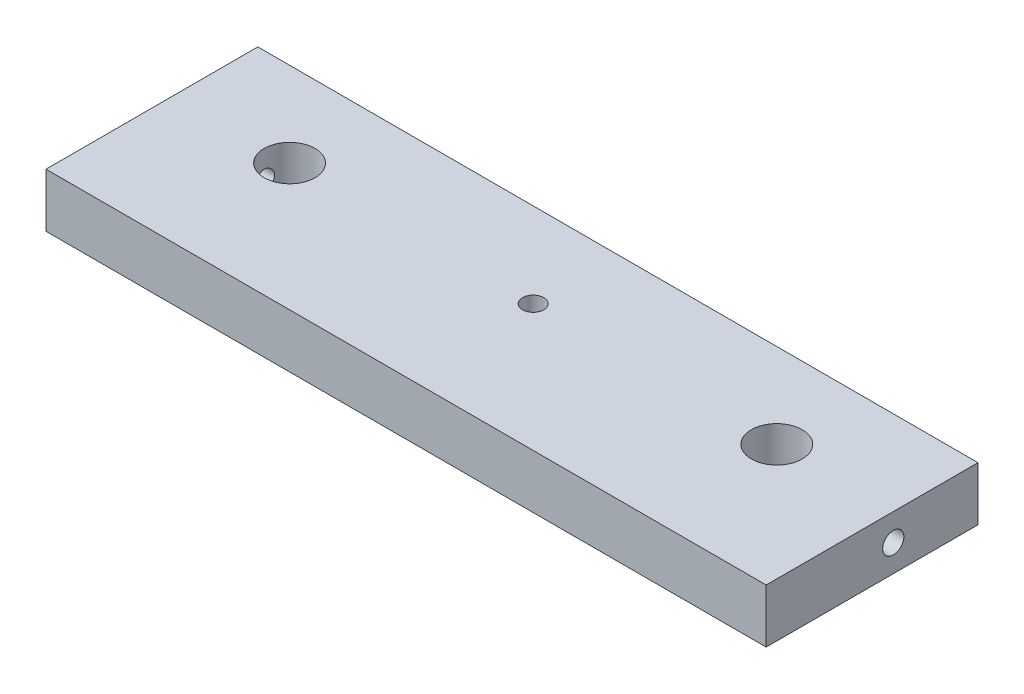
ISO-10303-21;
HEADER;
FILE_DESCRIPTION(('STEP AP214'),'2;1');
FILE_NAME('part.step','',(''),(''),'','','');
FILE_SCHEMA(('AUTOMOTIVE_DESIGN { 1 0 10303 214 1 1 1 1 }'));
ENDSEC;
DATA;
#1=APPLICATION_CONTEXT('core data for automotive mechanical design processes');
#2=APPLICATION_PROTOCOL_DEFINITION('international standard','automotive_design',2000,#1);
#3=PRODUCT_CONTEXT('',#1,'mechanical');
#4=PRODUCT('Part','Part','',(#3));
#5=PRODUCT_RELATED_PRODUCT_CATEGORY('part','',(#4));
#6=PRODUCT_DEFINITION_FORMATION('','',#4);
#7=PRODUCT_DEFINITION_CONTEXT('part definition',#1,'design');
#8=PRODUCT_DEFINITION('design','',#6,#7);
#9=PRODUCT_DEFINITION_SHAPE('','',#8);
#10=(LENGTH_UNIT() NAMED_UNIT(*) SI_UNIT(.MILLI.,.METRE.));
#11=(NAMED_UNIT(*) PLANE_ANGLE_UNIT() SI_UNIT($,.RADIAN.));
#12=(NAMED_UNIT(*) SI_UNIT($,.STERADIAN.) SOLID_ANGLE_UNIT());
#13=UNCERTAINTY_MEASURE_WITH_UNIT(LENGTH_MEASURE(1.E-05),#10,'distance_accuracy_value','');
#14=(GEOMETRIC_REPRESENTATION_CONTEXT(3) GLOBAL_UNCERTAINTY_ASSIGNED_CONTEXT((#13)) GLOBAL_UNIT_ASSIGNED_CONTEXT((#10,
#11,#12)) REPRESENTATION_CONTEXT('',''));
#15=CARTESIAN_POINT('',(0.,0.,0.));
#16=DIRECTION('',(0.,0.,1.));
#17=DIRECTION('',(1.,0.,0.));
#18=AXIS2_PLACEMENT_3D('',#15,#16,#17);
#19=CARTESIAN_POINT('',(0.,12.7,0.));
#20=DIRECTION('',(0.,-1.,0.));
#21=DIRECTION('',(0.,0.,-1.));
#22=AXIS2_PLACEMENT_3D('',#19,#20,#21);
#23=CYLINDRICAL_SURFACE('',#22,2.5);
#24=CARTESIAN_POINT('',(0.,12.7,0.));
#25=DIRECTION('',(0.,1.,0.));
#26=DIRECTION('',(0.,0.,1.));
#27=AXIS2_PLACEMENT_3D('',#24,#25,#26);
#28=CIRCLE('',#27,2.5);
#29=CARTESIAN_POINT('',(0.,12.7,2.49999999999999));
#30=VERTEX_POINT('',#29);
#31=EDGE_CURVE('E150',#30,#30,#28,.T.);
#32=ORIENTED_EDGE('',*,*,#31,.T.);
#33=EDGE_LOOP('',(#32));
#34=FACE_BOUND('',#33,.T.);
#35=CARTESIAN_POINT('',(0.,8.,0.));
#36=DIRECTION('',(0.,-1.,0.));
#37=DIRECTION('',(0.,0.,-1.));
#38=AXIS2_PLACEMENT_3D('',#35,#36,#37);
#39=CIRCLE('',#38,2.5);
#40=CARTESIAN_POINT('',(0.,8.,-2.50000000000001));
#41=VERTEX_POINT('',#40);
#42=EDGE_CURVE('E133',#41,#41,#39,.T.);
#43=ORIENTED_EDGE('',*,*,#42,.T.);
#44=EDGE_LOOP('',(#43));
#45=FACE_BOUND('',#44,.T.);
#46=ADVANCED_FACE('F41',(#34,#45),#23,.F.);
#47=CARTESIAN_POINT('',(0.,12.7,0.));
#48=DIRECTION('',(0.,1.,0.));
#49=DIRECTION('',(0.,0.,1.));
#50=AXIS2_PLACEMENT_3D('',#47,#48,#49);
#51=PLANE('',#50);
#52=CARTESIAN_POINT('',(-57.5,12.7,0.));
#53=DIRECTION('',(0.,1.,0.));
#54=DIRECTION('',(0.,0.,1.));
#55=AXIS2_PLACEMENT_3D('',#52,#53,#54);
#56=CIRCLE('',#55,6.);
#57=CARTESIAN_POINT('',(-57.5,12.7,5.99999999999999));
#58=VERTEX_POINT('',#57);
#59=EDGE_CURVE('E146',#58,#58,#56,.T.);
#60=ORIENTED_EDGE('',*,*,#59,.F.);
#61=EDGE_LOOP('',(#60));
#62=FACE_BOUND('',#61,.T.);
#63=DIRECTION('',(-1.,0.,0.));
#64=VECTOR('',#63,1.);
#65=CARTESIAN_POINT('',(75.,12.7,30.));
#66=LINE('',#65,#64);
#67=CARTESIAN_POINT('',(85.,12.7,30.));
#68=VERTEX_POINT('',#67);
#69=CARTESIAN_POINT('',(-85.,12.7,30.));
#70=VERTEX_POINT('',#69);
#71=EDGE_CURVE('E88',#68,#70,#66,.T.);
#72=ORIENTED_EDGE('',*,*,#71,.F.);
#73=DIRECTION('',(0.,0.,1.));
#74=VECTOR('',#73,1.);
#75=CARTESIAN_POINT('',(85.,12.7,-20.));
#76=LINE('',#75,#74);
#77=CARTESIAN_POINT('',(85.,12.7,-20.));
#78=VERTEX_POINT('',#77);
#79=EDGE_CURVE('E96',#78,#68,#76,.T.);
#80=ORIENTED_EDGE('',*,*,#79,.F.);
#81=DIRECTION('',(-1.,0.,0.));
#82=VECTOR('',#81,1.);
#83=CARTESIAN_POINT('',(-75.,12.7,-20.));
#84=LINE('',#83,#82);
#85=CARTESIAN_POINT('',(-85.,12.7,-20.));
#86=VERTEX_POINT('',#85);
#87=EDGE_CURVE('E11',#78,#86,#84,.T.);
#88=ORIENTED_EDGE('',*,*,#87,.T.);
#89=DIRECTION('',(0.,0.,-1.));
#90=VECTOR('',#89,1.);
#91=CARTESIAN_POINT('',(-85.,12.7,-20.));
#92=LINE('',#91,#90);
#93=EDGE_CURVE('E115',#70,#86,#92,.T.);
#94=ORIENTED_EDGE('',*,*,#93,.F.);
#95=EDGE_LOOP('',(#72,#80,#88,#94));
#96=FACE_BOUND('',#95,.T.);
#97=ORIENTED_EDGE('',*,*,#31,.F.);
#98=EDGE_LOOP('',(#97));
#99=FACE_BOUND('',#98,.T.);
#100=CARTESIAN_POINT('',(57.5,12.7,0.));
#101=DIRECTION('',(0.,1.,0.));
#102=DIRECTION('',(0.,0.,1.));
#103=AXIS2_PLACEMENT_3D('',#100,#101,#102);
#104=CIRCLE('',#103,6.);
#105=CARTESIAN_POINT('',(57.5,12.7,5.99999999999999));
#106=VERTEX_POINT('',#105);
#107=EDGE_CURVE('E137',#106,#106,#104,.T.);
#108=ORIENTED_EDGE('',*,*,#107,.F.);
#109=EDGE_LOOP('',(#108));
#110=FACE_BOUND('',#109,.T.);
#111=ADVANCED_FACE('F97',(#62,#96,#99,#110),#51,.T.);
#112=CARTESIAN_POINT('',(0.,0.,0.));
#113=DIRECTION('',(0.,1.,0.));
#114=DIRECTION('',(0.,0.,1.));
#115=AXIS2_PLACEMENT_3D('',#112,#113,#114);
#116=PLANE('',#115);
#117=CARTESIAN_POINT('',(0.,0.,0.));
#118=DIRECTION('',(0.,-1.,0.));
#119=DIRECTION('',(0.,0.,-1.));
#120=AXIS2_PLACEMENT_3D('',#117,#118,#119);
#121=CIRCLE('',#120,5.5);
#122=CARTESIAN_POINT('',(0.,0.,-5.50000000000001));
#123=VERTEX_POINT('',#122);
#124=EDGE_CURVE('E128',#123,#123,#121,.T.);
#125=ORIENTED_EDGE('',*,*,#124,.F.);
#126=EDGE_LOOP('',(#125));
#127=FACE_BOUND('',#126,.T.);
#128=DIRECTION('',(-1.,0.,0.));
#129=VECTOR('',#128,1.);
#130=CARTESIAN_POINT('',(-75.,0.,-20.));
#131=LINE('',#130,#129);
#132=CARTESIAN_POINT('',(85.,0.,-20.));
#133=VERTEX_POINT('',#132);
#134=CARTESIAN_POINT('',(-85.,0.,-20.));
#135=VERTEX_POINT('',#134);
#136=EDGE_CURVE('E57',#133,#135,#131,.T.);
#137=ORIENTED_EDGE('',*,*,#136,.F.);
#138=DIRECTION('',(0.,0.,1.));
#139=VECTOR('',#138,1.);
#140=CARTESIAN_POINT('',(85.,0.,-20.));
#141=LINE('',#140,#139);
#142=CARTESIAN_POINT('',(85.,0.,30.));
#143=VERTEX_POINT('',#142);
#144=EDGE_CURVE('E103',#133,#143,#141,.T.);
#145=ORIENTED_EDGE('',*,*,#144,.T.);
#146=DIRECTION('',(-1.,0.,0.));
#147=VECTOR('',#146,1.);
#148=CARTESIAN_POINT('',(75.,0.,30.));
#149=LINE('',#148,#147);
#150=CARTESIAN_POINT('',(-85.,0.,30.));
#151=VERTEX_POINT('',#150);
#152=EDGE_CURVE('E120',#143,#151,#149,.T.);
#153=ORIENTED_EDGE('',*,*,#152,.T.);
#154=DIRECTION('',(0.,0.,-1.));
#155=VECTOR('',#154,1.);
#156=CARTESIAN_POINT('',(-85.,0.,-20.));
#157=LINE('',#156,#155);
#158=EDGE_CURVE('E107',#151,#135,#157,.T.);
#159=ORIENTED_EDGE('',*,*,#158,.T.);
#160=EDGE_LOOP('',(#137,#145,#153,#159));
#161=FACE_BOUND('',#160,.T.);
#162=CARTESIAN_POINT('',(-57.5,0.,0.));
#163=DIRECTION('',(0.,1.,0.));
#164=DIRECTION('',(0.,0.,1.));
#165=AXIS2_PLACEMENT_3D('',#162,#163,#164);
#166=CIRCLE('',#165,6.);
#167=CARTESIAN_POINT('',(-57.5,0.,5.99999999999999));
#168=VERTEX_POINT('',#167);
#169=EDGE_CURVE('E141',#168,#168,#166,.T.);
#170=ORIENTED_EDGE('',*,*,#169,.T.);
#171=EDGE_LOOP('',(#170));
#172=FACE_BOUND('',#171,.T.);
#173=CARTESIAN_POINT('',(57.5,0.,0.));
#174=DIRECTION('',(0.,1.,0.));
#175=DIRECTION('',(0.,0.,1.));
#176=AXIS2_PLACEMENT_3D('',#173,#174,#175);
#177=CIRCLE('',#176,6.);
#178=CARTESIAN_POINT('',(57.5,0.,5.99999999999999));
#179=VERTEX_POINT('',#178);
#180=EDGE_CURVE('E142',#179,#179,#177,.T.);
#181=ORIENTED_EDGE('',*,*,#180,.T.);
#182=EDGE_LOOP('',(#181));
#183=FACE_BOUND('',#182,.T.);
#184=ADVANCED_FACE('F211',(#127,#161,#172,#183),#116,.F.);
#185=CARTESIAN_POINT('',(-75.,12.7,-20.));
#186=DIRECTION('',(0.,0.,1.));
#187=DIRECTION('',(1.,0.,0.));
#188=AXIS2_PLACEMENT_3D('',#185,#186,#187);
#189=PLANE('',#188);
#190=ORIENTED_EDGE('',*,*,#136,.T.);
#191=DIRECTION('',(0.,-1.,0.));
#192=VECTOR('',#191,1.);
#193=CARTESIAN_POINT('',(-85.,63.6901951359279,-20.));
#194=LINE('',#193,#192);
#195=EDGE_CURVE('E93',#86,#135,#194,.T.);
#196=ORIENTED_EDGE('',*,*,#195,.F.);
#197=ORIENTED_EDGE('',*,*,#87,.F.);
#198=DIRECTION('',(0.,-1.,0.));
#199=VECTOR('',#198,1.);
#200=CARTESIAN_POINT('',(85.,63.6901951359279,-20.));
#201=LINE('',#200,#199);
#202=EDGE_CURVE('E91',#78,#133,#201,.T.);
#203=ORIENTED_EDGE('',*,*,#202,.T.);
#204=EDGE_LOOP('',(#190,#196,#197,#203));
#205=FACE_BOUND('',#204,.T.);
#206=ADVANCED_FACE('F43',(#205),#189,.F.);
#207=CARTESIAN_POINT('',(-57.5,12.7,0.));
#208=DIRECTION('',(0.,-1.,0.));
#209=DIRECTION('',(0.,0.,-1.));
#210=AXIS2_PLACEMENT_3D('',#207,#208,#209);
#211=CYLINDRICAL_SURFACE('',#210,6.);
#212=CARTESIAN_POINT('',(-63.1204981985586,6.35,2.09999999999999));
#213=CARTESIAN_POINT('',(-63.1204966458315,6.2359908629341,2.10000183392046));
#214=CARTESIAN_POINT('',(-63.1240049683131,6.12199450023092,2.09068443415069));
#215=CARTESIAN_POINT('',(-63.1375766475588,5.89740246387318,2.05380341211709));
#216=CARTESIAN_POINT('',(-63.1476405489665,5.7868070735741,2.02623827381127));
#217=CARTESIAN_POINT('',(-63.1730467856987,5.57231198983434,1.95396754262052));
#218=CARTESIAN_POINT('',(-63.1883778981936,5.46839861341697,1.90929837025929));
#219=CARTESIAN_POINT('',(-63.2225741385746,5.26950393955718,1.80421393109002));
#220=CARTESIAN_POINT('',(-63.2414401646371,5.17452492145415,1.74379466085327));
#221=CARTESIAN_POINT('',(-63.2814940549531,4.99209282993042,1.60612976379037));
#222=CARTESIAN_POINT('',(-63.3027439771117,4.90508129369762,1.52831692511238));
#223=CARTESIAN_POINT('',(-63.3446495230057,4.74503750358003,1.35928149750692));
#224=CARTESIAN_POINT('',(-63.3653050393114,4.67200776337503,1.26805650251292));
#225=CARTESIAN_POINT('',(-63.4044203342876,4.53994992264804,1.07151011163135));
#226=CARTESIAN_POINT('',(-63.422798719403,4.48139114595428,0.965855744444182));
#227=CARTESIAN_POINT('',(-63.4545521614656,4.38305622935087,0.745440860528095));
#228=CARTESIAN_POINT('',(-63.4679287144992,4.34327447215527,0.630683079168856));
#229=CARTESIAN_POINT('',(-63.487731406374,4.28513985351416,0.399953329353732));
#230=CARTESIAN_POINT('',(-63.4944026630636,4.26602915296876,0.284193742860484));
#231=CARTESIAN_POINT('',(-63.500916889704,4.24736229480847,0.0509313612862899));
#232=CARTESIAN_POINT('',(-63.5007617963172,4.24780059106696,-0.0665709299256026));
#233=CARTESIAN_POINT('',(-63.4938029881401,4.26775376980731,-0.294593124821956));
#234=CARTESIAN_POINT('',(-63.4872866813233,4.28644401820294,-0.405195428634553));
#235=CARTESIAN_POINT('',(-63.4687047041447,4.34099781675359,-0.621581077155499));
#236=CARTESIAN_POINT('',(-63.4566386491988,4.37686255706658,-0.727364087339987));
#237=CARTESIAN_POINT('',(-63.4279632181631,4.46518958192665,-0.932828899090628));
#238=CARTESIAN_POINT('',(-63.4112935314734,4.51787375120113,-1.032406550088));
#239=CARTESIAN_POINT('',(-63.3751275446254,4.63815647199501,-1.22154070440799));
#240=CARTESIAN_POINT('',(-63.3556304054743,4.70575945350492,-1.31109421923475));
#241=CARTESIAN_POINT('',(-63.3146607396164,4.85804728813643,-1.48252795143937));
#242=CARTESIAN_POINT('',(-63.293138193974,4.94343322101615,-1.56377436704445));
#243=CARTESIAN_POINT('',(-63.2513741792681,5.12678239026934,-1.71101327031472));
#244=CARTESIAN_POINT('',(-63.2311329525691,5.22474799556688,-1.77700287834318));
#245=CARTESIAN_POINT('',(-63.1939329395488,5.43267204143827,-1.89285691923177));
#246=CARTESIAN_POINT('',(-63.1770363214733,5.54280717368503,-1.94242576165358));
#247=CARTESIAN_POINT('',(-63.1491557259306,5.77060480898083,-2.02208854460283));
#248=CARTESIAN_POINT('',(-63.1381689626197,5.88826373607349,-2.05219166242463));
#249=CARTESIAN_POINT('',(-63.1239926358183,6.1215780497682,-2.09071998372688));
#250=CARTESIAN_POINT('',(-63.1204464929988,6.23704783857021,-2.10013762361127));
#251=CARTESIAN_POINT('',(-63.1205510138731,6.46794749629982,-2.0998594060516));
#252=CARTESIAN_POINT('',(-63.1242001922755,6.58337736854775,-2.09016749328915));
#253=CARTESIAN_POINT('',(-63.1379260131842,6.80619087101844,-2.05284050372258));
#254=CARTESIAN_POINT('',(-63.1477449606931,6.91371252015608,-2.02592405668403));
#255=CARTESIAN_POINT('',(-63.172411835872,7.12268184137405,-1.95579041232059));
#256=CARTESIAN_POINT('',(-63.187260710863,7.22412836504528,-1.91257014420932));
#257=CARTESIAN_POINT('',(-63.2209397100575,7.42190566650239,-1.80938709290032));
#258=CARTESIAN_POINT('',(-63.2398883080368,7.51794411702222,-1.74890374170465));
#259=CARTESIAN_POINT('',(-63.2794141217829,7.69886506913831,-1.61348700379828));
#260=CARTESIAN_POINT('',(-63.299991862819,7.78374394899801,-1.53854894531554));
#261=CARTESIAN_POINT('',(-63.3417987141558,7.94467237125451,-1.37155948469132));
#262=CARTESIAN_POINT('',(-63.3630031413795,8.01999931558661,-1.27880333095808));
#263=CARTESIAN_POINT('',(-63.4025922369694,8.15408108159508,-1.0814435616735));
#264=CARTESIAN_POINT('',(-63.4209769708418,8.21283628828728,-0.976840221450329));
#265=CARTESIAN_POINT('',(-63.4527928174187,8.31161255653305,-0.75912969805903));
#266=CARTESIAN_POINT('',(-63.4662513931254,8.35173782619562,-0.646074027219719));
#267=CARTESIAN_POINT('',(-63.4868116209636,8.41221534858065,-0.414248850041633));
#268=CARTESIAN_POINT('',(-63.4939158314934,8.43257555940527,-0.295481663590947));
#269=CARTESIAN_POINT('',(-63.5007543784025,8.45217224756213,-0.0621821302514194));
#270=CARTESIAN_POINT('',(-63.5008490305037,8.4524414770833,0.0522537808563997));
#271=CARTESIAN_POINT('',(-63.4945652025213,8.43443834225148,0.279465044357213));
#272=CARTESIAN_POINT('',(-63.488187341248,8.41616775041485,0.392240554448663));
#273=CARTESIAN_POINT('',(-63.4698207390079,8.36230718488033,0.610778183645894));
#274=CARTESIAN_POINT('',(-63.4579408866853,8.32705281210021,0.716632835676147));
#275=CARTESIAN_POINT('',(-63.4297968290422,8.24054437409332,0.920954416283837));
#276=CARTESIAN_POINT('',(-63.4135318086933,8.18928733432667,1.01941996716771));
#277=CARTESIAN_POINT('',(-63.3774819301746,8.0699273702229,1.21038035179718));
#278=CARTESIAN_POINT('',(-63.3575841614481,8.00124327140596,1.30249027603846));
#279=CARTESIAN_POINT('',(-63.3167443389257,7.84993840062415,1.47420813664784));
#280=CARTESIAN_POINT('',(-63.2958019368387,7.76731295830422,1.55381186612155));
#281=CARTESIAN_POINT('',(-63.254114729544,7.58609774587121,1.70186578231573));
#282=CARTESIAN_POINT('',(-63.2334198977672,7.48696240034784,1.76966457617208));
#283=CARTESIAN_POINT('',(-63.1956781363437,7.27805137141014,1.88761831198949));
#284=CARTESIAN_POINT('',(-63.1786307346967,7.16827706741829,1.9377755374217));
#285=CARTESIAN_POINT('',(-63.1505252243276,6.94231742183715,2.0182610046831));
#286=CARTESIAN_POINT('',(-63.1394028261945,6.82621662407043,2.04880286372059));
#287=CARTESIAN_POINT('',(-63.1243917548636,6.59007130080431,2.08966685598282));
#288=CARTESIAN_POINT('',(-63.1204998332662,6.47002857095732,2.09999806925252));
#289=CARTESIAN_POINT('',(-63.1204981985586,6.35,2.09999999999999));
#290=B_SPLINE_CURVE_WITH_KNOTS('',3,(#212,#213,#214,#215,#216,#217,#218,#219,#220,#221,#222,
#223,#224,#225,#226,#227,#228,#229,#230,#231,#232,#233,#234,#235,#236,#237,#238,#239,#240,#241,
#242,#243,#244,#245,#246,#247,#248,#249,#250,#251,#252,#253,#254,#255,#256,#257,#258,#259,#260,
#261,#262,#263,#264,#265,#266,#267,#268,#269,#270,#271,#272,#273,#274,#275,#276,#277,#278,#279,
#280,#281,#282,#283,#284,#285,#286,#287,#288,#289),.UNSPECIFIED.,.T.,.F.,(4,2,2,2,2,2,2,2,2,2,2,
2,2,2,2,2,2,2,2,2,2,2,2,2,2,2,2,2,2,2,2,2,2,2,2,2,2,2,4),(0.,0.341581962713036,
0.683192307989643,1.02407925348462,1.36505293174606,1.71940579240763,2.07382229975039,
2.43855298376331,2.80317448659719,3.15392083853409,3.5045676829967,3.8400719478235,
4.17559946579064,4.5157501416598,4.85600195806707,5.21379905942501,5.57166363794494,
5.93565848344083,6.29948159486756,6.6454288702843,6.99130474115209,7.32361553252675,
7.65598894513421,7.99969400689682,8.34351034108725,8.7058603989328,9.06820203750372,
9.42849171734222,9.78863627174604,10.1302545747611,10.471840220127,10.806936933281,
11.1420959705822,11.4903822545165,11.8387854469785,12.2026433598833,12.5664541587759,
12.9262325794049,13.2858493250833),.UNSPECIFIED.);
#291=CARTESIAN_POINT('',(-63.1204981985586,6.35,2.09999999999999));
#292=VERTEX_POINT('',#291);
#293=EDGE_CURVE('E45',#292,#292,#290,.T.);
#294=ORIENTED_EDGE('',*,*,#293,.F.);
#295=EDGE_LOOP('',(#294));
#296=FACE_BOUND('',#295,.T.);
#297=ORIENTED_EDGE('',*,*,#59,.T.);
#298=EDGE_LOOP('',(#297));
#299=FACE_BOUND('',#298,.T.);
#300=ORIENTED_EDGE('',*,*,#169,.F.);
#301=EDGE_LOOP('',(#300));
#302=FACE_BOUND('',#301,.T.);
#303=ADVANCED_FACE('F201',(#296,#299,#302),#211,.F.);
#304=CARTESIAN_POINT('',(57.5,12.7,0.));
#305=DIRECTION('',(0.,-1.,0.));
#306=DIRECTION('',(0.,0.,-1.));
#307=AXIS2_PLACEMENT_3D('',#304,#305,#306);
#308=CYLINDRICAL_SURFACE('',#307,6.);
#309=CARTESIAN_POINT('',(63.1204981985586,6.35,-2.1));
#310=CARTESIAN_POINT('',(63.1204966458315,6.2359908629341,-2.10000183392047));
#311=CARTESIAN_POINT('',(63.124004968313,6.12199450023092,-2.0906844341507));
#312=CARTESIAN_POINT('',(63.1375766475588,5.89740246387318,-2.05380341211709));
#313=CARTESIAN_POINT('',(63.1476405489665,5.7868070735741,-2.02623827381128));
#314=CARTESIAN_POINT('',(63.1730467856987,5.57231198983434,-1.95396754262052));
#315=CARTESIAN_POINT('',(63.1883778981936,5.46839861341697,-1.90929837025929));
#316=CARTESIAN_POINT('',(63.2225741385746,5.26950393955718,-1.80421393109003));
#317=CARTESIAN_POINT('',(63.241440164637,5.17452492145415,-1.74379466085327));
#318=CARTESIAN_POINT('',(63.2814940549531,4.99209282993042,-1.60612976379037));
#319=CARTESIAN_POINT('',(63.3027439771117,4.90508129369763,-1.52831692511239));
#320=CARTESIAN_POINT('',(63.3446495230057,4.74503750358003,-1.35928149750692));
#321=CARTESIAN_POINT('',(63.3653050393113,4.67200776337503,-1.26805650251292));
#322=CARTESIAN_POINT('',(63.4044203342876,4.53994992264804,-1.07151011163135));
#323=CARTESIAN_POINT('',(63.422798719403,4.48139114595428,-0.965855744444188));
#324=CARTESIAN_POINT('',(63.4545521614656,4.38305622935087,-0.745440860528101));
#325=CARTESIAN_POINT('',(63.4679287144992,4.34327447215527,-0.630683079168863));
#326=CARTESIAN_POINT('',(63.487731406374,4.28513985351416,-0.399953329353739));
#327=CARTESIAN_POINT('',(63.4944026630635,4.26602915296876,-0.284193742860491));
#328=CARTESIAN_POINT('',(63.500916889704,4.24736229480847,-0.050931361286297));
#329=CARTESIAN_POINT('',(63.5007617963171,4.24780059106696,0.0665709299255955));
#330=CARTESIAN_POINT('',(63.4938029881401,4.26775376980731,0.294593124821948));
#331=CARTESIAN_POINT('',(63.4872866813233,4.28644401820294,0.405195428634545));
#332=CARTESIAN_POINT('',(63.4687047041447,4.34099781675359,0.621581077155492));
#333=CARTESIAN_POINT('',(63.4566386491988,4.37686255706658,0.727364087339979));
#334=CARTESIAN_POINT('',(63.4279632181631,4.46518958192665,0.93282889909062));
#335=CARTESIAN_POINT('',(63.4112935314734,4.51787375120113,1.032406550088));
#336=CARTESIAN_POINT('',(63.3751275446253,4.63815647199501,1.22154070440798));
#337=CARTESIAN_POINT('',(63.3556304054743,4.70575945350491,1.31109421923474));
#338=CARTESIAN_POINT('',(63.3146607396164,4.85804728813643,1.48252795143936));
#339=CARTESIAN_POINT('',(63.293138193974,4.94343322101615,1.56377436704444));
#340=CARTESIAN_POINT('',(63.2513741792681,5.12678239026934,1.71101327031471));
#341=CARTESIAN_POINT('',(63.2311329525691,5.22474799556688,1.77700287834317));
#342=CARTESIAN_POINT('',(63.1939329395488,5.43267204143827,1.89285691923176));
#343=CARTESIAN_POINT('',(63.1770363214733,5.54280717368503,1.94242576165357));
#344=CARTESIAN_POINT('',(63.1491557259306,5.77060480898083,2.02208854460282));
#345=CARTESIAN_POINT('',(63.1381689626197,5.8882637360735,2.05219166242462));
#346=CARTESIAN_POINT('',(63.1239926358183,6.1215780497682,2.09071998372688));
#347=CARTESIAN_POINT('',(63.1204464929988,6.23704783857021,2.10013762361126));
#348=CARTESIAN_POINT('',(63.1205510138731,6.46794749629982,2.09985940605159));
#349=CARTESIAN_POINT('',(63.1242001922755,6.58337736854775,2.09016749328915));
#350=CARTESIAN_POINT('',(63.1379260131842,6.80619087101844,2.05284050372257));
#351=CARTESIAN_POINT('',(63.1477449606931,6.91371252015608,2.02592405668402));
#352=CARTESIAN_POINT('',(63.1724118358719,7.12268184137405,1.95579041232058));
#353=CARTESIAN_POINT('',(63.187260710863,7.22412836504528,1.91257014420931));
#354=CARTESIAN_POINT('',(63.2209397100575,7.42190566650239,1.80938709290031));
#355=CARTESIAN_POINT('',(63.2398883080368,7.51794411702222,1.74890374170464));
#356=CARTESIAN_POINT('',(63.2794141217829,7.69886506913831,1.61348700379827));
#357=CARTESIAN_POINT('',(63.299991862819,7.78374394899801,1.53854894531553));
#358=CARTESIAN_POINT('',(63.3417987141558,7.94467237125451,1.37155948469131));
#359=CARTESIAN_POINT('',(63.3630031413794,8.01999931558661,1.27880333095807));
#360=CARTESIAN_POINT('',(63.4025922369694,8.15408108159508,1.08144356167349));
#361=CARTESIAN_POINT('',(63.4209769708418,8.21283628828728,0.976840221450322));
#362=CARTESIAN_POINT('',(63.4527928174187,8.31161255653305,0.759129698059022));
#363=CARTESIAN_POINT('',(63.4662513931254,8.35173782619562,0.646074027219711));
#364=CARTESIAN_POINT('',(63.4868116209636,8.41221534858065,0.414248850041624));
#365=CARTESIAN_POINT('',(63.4939158314934,8.43257555940527,0.295481663590938));
#366=CARTESIAN_POINT('',(63.5007543784025,8.45217224756213,0.0621821302514094));
#367=CARTESIAN_POINT('',(63.5008490305037,8.4524414770833,-0.05225378085641));
#368=CARTESIAN_POINT('',(63.4945652025212,8.43443834225148,-0.279465044357223));
#369=CARTESIAN_POINT('',(63.488187341248,8.41616775041485,-0.392240554448671));
#370=CARTESIAN_POINT('',(63.4698207390079,8.36230718488033,-0.610778183645903));
#371=CARTESIAN_POINT('',(63.4579408866853,8.32705281210021,-0.716632835676158));
#372=CARTESIAN_POINT('',(63.4297968290422,8.24054437409332,-0.920954416283847));
#373=CARTESIAN_POINT('',(63.4135318086933,8.18928733432667,-1.01941996716771));
#374=CARTESIAN_POINT('',(63.3774819301746,8.0699273702229,-1.21038035179719));
#375=CARTESIAN_POINT('',(63.3575841614481,8.00124327140596,-1.30249027603846));
#376=CARTESIAN_POINT('',(63.3167443389257,7.84993840062415,-1.47420813664784));
#377=CARTESIAN_POINT('',(63.2958019368387,7.76731295830422,-1.55381186612156));
#378=CARTESIAN_POINT('',(63.254114729544,7.58609774587121,-1.70186578231573));
#379=CARTESIAN_POINT('',(63.2334198977672,7.48696240034784,-1.76966457617208));
#380=CARTESIAN_POINT('',(63.1956781363437,7.27805137141014,-1.8876183119895));
#381=CARTESIAN_POINT('',(63.1786307346966,7.16827706741829,-1.93777553742171));
#382=CARTESIAN_POINT('',(63.1505252243276,6.94231742183715,-2.01826100468311));
#383=CARTESIAN_POINT('',(63.1394028261945,6.82621662407043,-2.0488028637206));
#384=CARTESIAN_POINT('',(63.1243917548635,6.59007130080431,-2.08966685598283));
#385=CARTESIAN_POINT('',(63.1204998332662,6.47002857095732,-2.09999806925252));
#386=CARTESIAN_POINT('',(63.1204981985586,6.35,-2.1));
#387=B_SPLINE_CURVE_WITH_KNOTS('',3,(#309,#310,#311,#312,#313,#314,#315,#316,#317,#318,#319,
#320,#321,#322,#323,#324,#325,#326,#327,#328,#329,#330,#331,#332,#333,#334,#335,#336,#337,#338,
#339,#340,#341,#342,#343,#344,#345,#346,#347,#348,#349,#350,#351,#352,#353,#354,#355,#356,#357,
#358,#359,#360,#361,#362,#363,#364,#365,#366,#367,#368,#369,#370,#371,#372,#373,#374,#375,#376,
#377,#378,#379,#380,#381,#382,#383,#384,#385,#386),.UNSPECIFIED.,.T.,.F.,(4,2,2,2,2,2,2,2,2,2,2,
2,2,2,2,2,2,2,2,2,2,2,2,2,2,2,2,2,2,2,2,2,2,2,2,2,2,2,4),(0.,0.341581962713037,
0.683192307989643,1.02407925348462,1.36505293174606,1.71940579240763,2.07382229975039,
2.43855298376332,2.80317448659719,3.15392083853409,3.5045676829967,3.8400719478235,
4.17559946579064,4.51575014165979,4.85600195806707,5.213799059425,5.57166363794494,
5.93565848344083,6.29948159486756,6.64542887028431,6.99130474115209,7.32361553252676,
7.65598894513421,7.99969400689682,8.34351034108725,8.70586039893279,9.06820203750372,
9.42849171734222,9.78863627174604,10.1302545747611,10.471840220127,10.806936933281,
11.1420959705822,11.4903822545165,11.8387854469785,12.2026433598833,12.5664541587759,
12.9262325794049,13.2858493250833),.UNSPECIFIED.);
#388=CARTESIAN_POINT('',(63.1204981985586,6.35,-2.1));
#389=VERTEX_POINT('',#388);
#390=EDGE_CURVE('E161',#389,#389,#387,.T.);
#391=ORIENTED_EDGE('',*,*,#390,.F.);
#392=EDGE_LOOP('',(#391));
#393=FACE_BOUND('',#392,.T.);
#394=ORIENTED_EDGE('',*,*,#107,.T.);
#395=EDGE_LOOP('',(#394));
#396=FACE_BOUND('',#395,.T.);
#397=ORIENTED_EDGE('',*,*,#180,.F.);
#398=EDGE_LOOP('',(#397));
#399=FACE_BOUND('',#398,.T.);
#400=ADVANCED_FACE('F170',(#393,#396,#399),#308,.F.);
#401=CARTESIAN_POINT('',(0.,8.,0.));
#402=DIRECTION('',(0.,-1.,0.));
#403=DIRECTION('',(0.,0.,-1.));
#404=AXIS2_PLACEMENT_3D('',#401,#402,#403);
#405=CYLINDRICAL_SURFACE('',#404,5.5);
#406=CARTESIAN_POINT('',(0.,8.,0.));
#407=DIRECTION('',(0.,-1.,0.));
#408=DIRECTION('',(0.,0.,-1.));
#409=AXIS2_PLACEMENT_3D('',#406,#407,#408);
#410=CIRCLE('',#409,5.5);
#411=CARTESIAN_POINT('',(0.,8.,-5.50000000000001));
#412=VERTEX_POINT('',#411);
#413=EDGE_CURVE('E129',#412,#412,#410,.T.);
#414=ORIENTED_EDGE('',*,*,#413,.F.);
#415=EDGE_LOOP('',(#414));
#416=FACE_BOUND('',#415,.T.);
#417=ORIENTED_EDGE('',*,*,#124,.T.);
#418=EDGE_LOOP('',(#417));
#419=FACE_BOUND('',#418,.T.);
#420=ADVANCED_FACE('F194',(#416,#419),#405,.F.);
#421=CARTESIAN_POINT('',(0.,8.,0.));
#422=DIRECTION('',(0.,-1.,0.));
#423=DIRECTION('',(0.,0.,-1.));
#424=AXIS2_PLACEMENT_3D('',#421,#422,#423);
#425=PLANE('',#424);
#426=ORIENTED_EDGE('',*,*,#42,.F.);
#427=EDGE_LOOP('',(#426));
#428=FACE_BOUND('',#427,.T.);
#429=ORIENTED_EDGE('',*,*,#413,.T.);
#430=EDGE_LOOP('',(#429));
#431=FACE_BOUND('',#430,.T.);
#432=ADVANCED_FACE('F191',(#428,#431),#425,.T.);
#433=CARTESIAN_POINT('',(75.,163.032963783729,30.));
#434=DIRECTION('',(0.,0.,1.));
#435=DIRECTION('',(1.,0.,0.));
#436=AXIS2_PLACEMENT_3D('',#433,#434,#435);
#437=PLANE('',#436);
#438=ORIENTED_EDGE('',*,*,#152,.F.);
#439=DIRECTION('',(0.,-1.,0.));
#440=VECTOR('',#439,1.);
#441=CARTESIAN_POINT('',(85.,63.6901951359279,30.));
#442=LINE('',#441,#440);
#443=EDGE_CURVE('E102',#68,#143,#442,.T.);
#444=ORIENTED_EDGE('',*,*,#443,.F.);
#445=ORIENTED_EDGE('',*,*,#71,.T.);
#446=DIRECTION('',(0.,-1.,0.));
#447=VECTOR('',#446,1.);
#448=CARTESIAN_POINT('',(-85.,63.6901951359279,30.));
#449=LINE('',#448,#447);
#450=EDGE_CURVE('E111',#70,#151,#449,.T.);
#451=ORIENTED_EDGE('',*,*,#450,.T.);
#452=EDGE_LOOP('',(#438,#444,#445,#451));
#453=FACE_BOUND('',#452,.T.);
#454=ADVANCED_FACE('F187',(#453),#437,.T.);
#455=CARTESIAN_POINT('',(-85.,63.6901951359279,-20.));
#456=DIRECTION('',(-1.,0.,0.));
#457=DIRECTION('',(0.,0.,1.));
#458=AXIS2_PLACEMENT_3D('',#455,#456,#457);
#459=PLANE('',#458);
#460=CARTESIAN_POINT('',(-85.,6.35,0.));
#461=DIRECTION('',(-1.,0.,0.));
#462=DIRECTION('',(0.,0.,1.));
#463=AXIS2_PLACEMENT_3D('',#460,#461,#462);
#464=CIRCLE('',#463,2.5);
#465=CARTESIAN_POINT('',(-85.,6.35,2.49999999999999));
#466=VERTEX_POINT('',#465);
#467=EDGE_CURVE('E252',#466,#466,#464,.T.);
#468=ORIENTED_EDGE('',*,*,#467,.F.);
#469=EDGE_LOOP('',(#468));
#470=FACE_BOUND('',#469,.T.);
#471=ORIENTED_EDGE('',*,*,#450,.F.);
#472=ORIENTED_EDGE('',*,*,#93,.T.);
#473=ORIENTED_EDGE('',*,*,#195,.T.);
#474=ORIENTED_EDGE('',*,*,#158,.F.);
#475=EDGE_LOOP('',(#471,#472,#473,#474));
#476=FACE_BOUND('',#475,.T.);
#477=ADVANCED_FACE('F183',(#470,#476),#459,.T.);
#478=CARTESIAN_POINT('',(85.,63.6901951359279,-20.));
#479=DIRECTION('',(1.,0.,0.));
#480=DIRECTION('',(0.,0.,-1.));
#481=AXIS2_PLACEMENT_3D('',#478,#479,#480);
#482=PLANE('',#481);
#483=CARTESIAN_POINT('',(85.,6.35,0.));
#484=DIRECTION('',(1.,0.,0.));
#485=DIRECTION('',(0.,0.,-1.));
#486=AXIS2_PLACEMENT_3D('',#483,#484,#485);
#487=CIRCLE('',#486,2.5);
#488=CARTESIAN_POINT('',(85.,6.35,-2.5));
#489=VERTEX_POINT('',#488);
#490=EDGE_CURVE('E238',#489,#489,#487,.T.);
#491=ORIENTED_EDGE('',*,*,#490,.F.);
#492=EDGE_LOOP('',(#491));
#493=FACE_BOUND('',#492,.T.);
#494=ORIENTED_EDGE('',*,*,#202,.F.);
#495=ORIENTED_EDGE('',*,*,#79,.T.);
#496=ORIENTED_EDGE('',*,*,#443,.T.);
#497=ORIENTED_EDGE('',*,*,#144,.F.);
#498=EDGE_LOOP('',(#494,#495,#496,#497));
#499=FACE_BOUND('',#498,.T.);
#500=ADVANCED_FACE('F105',(#493,#499),#482,.T.);
#501=CARTESIAN_POINT('',(85.,6.35,0.));
#502=DIRECTION('',(1.,0.,0.));
#503=DIRECTION('',(0.,0.,-1.));
#504=AXIS2_PLACEMENT_3D('',#501,#502,#503);
#505=CYLINDRICAL_SURFACE('',#504,2.1);
#506=ORIENTED_EDGE('',*,*,#390,.T.);
#507=EDGE_LOOP('',(#506));
#508=FACE_BOUND('',#507,.T.);
#509=CARTESIAN_POINT('',(80.,6.35,0.));
#510=DIRECTION('',(1.,0.,0.));
#511=DIRECTION('',(0.,0.,-1.));
#512=AXIS2_PLACEMENT_3D('',#509,#510,#511);
#513=CIRCLE('',#512,2.1);
#514=CARTESIAN_POINT('',(80.,6.35,-2.1));
#515=VERTEX_POINT('',#514);
#516=EDGE_CURVE('E169',#515,#515,#513,.T.);
#517=ORIENTED_EDGE('',*,*,#516,.T.);
#518=EDGE_LOOP('',(#517));
#519=FACE_BOUND('',#518,.T.);
#520=ADVANCED_FACE('F173',(#508,#519),#505,.F.);
#521=CARTESIAN_POINT('',(80.,8.45,0.));
#522=DIRECTION('',(-1.,0.,0.));
#523=DIRECTION('',(0.,0.,1.));
#524=AXIS2_PLACEMENT_3D('',#521,#522,#523);
#525=PLANE('',#524);
#526=ORIENTED_EDGE('',*,*,#516,.F.);
#527=EDGE_LOOP('',(#526));
#528=FACE_BOUND('',#527,.T.);
#529=CARTESIAN_POINT('',(80.,6.35,0.));
#530=DIRECTION('',(1.,0.,0.));
#531=DIRECTION('',(0.,0.,-1.));
#532=AXIS2_PLACEMENT_3D('',#529,#530,#531);
#533=CIRCLE('',#532,2.5);
#534=CARTESIAN_POINT('',(80.,6.35,-2.5));
#535=VERTEX_POINT('',#534);
#536=EDGE_CURVE('E243',#535,#535,#533,.T.);
#537=ORIENTED_EDGE('',*,*,#536,.T.);
#538=EDGE_LOOP('',(#537));
#539=FACE_BOUND('',#538,.T.);
#540=ADVANCED_FACE('F178',(#528,#539),#525,.F.);
#541=CARTESIAN_POINT('',(85.,6.35,0.));
#542=DIRECTION('',(1.,0.,0.));
#543=DIRECTION('',(0.,0.,-1.));
#544=AXIS2_PLACEMENT_3D('',#541,#542,#543);
#545=CYLINDRICAL_SURFACE('',#544,2.5);
#546=ORIENTED_EDGE('',*,*,#536,.F.);
#547=EDGE_LOOP('',(#546));
#548=FACE_BOUND('',#547,.T.);
#549=ORIENTED_EDGE('',*,*,#490,.T.);
#550=EDGE_LOOP('',(#549));
#551=FACE_BOUND('',#550,.T.);
#552=ADVANCED_FACE('F271',(#548,#551),#545,.F.);
#553=CARTESIAN_POINT('',(-85.,6.35,0.));
#554=DIRECTION('',(-1.,0.,0.));
#555=DIRECTION('',(0.,0.,1.));
#556=AXIS2_PLACEMENT_3D('',#553,#554,#555);
#557=CYLINDRICAL_SURFACE('',#556,2.1);
#558=ORIENTED_EDGE('',*,*,#293,.T.);
#559=EDGE_LOOP('',(#558));
#560=FACE_BOUND('',#559,.T.);
#561=CARTESIAN_POINT('',(-80.,6.35,0.));
#562=DIRECTION('',(-1.,0.,0.));
#563=DIRECTION('',(0.,0.,1.));
#564=AXIS2_PLACEMENT_3D('',#561,#562,#563);
#565=CIRCLE('',#564,2.1);
#566=CARTESIAN_POINT('',(-80.,6.35,2.09999999999999));
#567=VERTEX_POINT('',#566);
#568=EDGE_CURVE('E239',#567,#567,#565,.T.);
#569=ORIENTED_EDGE('',*,*,#568,.T.);
#570=EDGE_LOOP('',(#569));
#571=FACE_BOUND('',#570,.T.);
#572=ADVANCED_FACE('F276',(#560,#571),#557,.F.);
#573=CARTESIAN_POINT('',(-80.,8.45,0.));
#574=DIRECTION('',(1.,0.,0.));
#575=DIRECTION('',(0.,0.,-1.));
#576=AXIS2_PLACEMENT_3D('',#573,#574,#575);
#577=PLANE('',#576);
#578=ORIENTED_EDGE('',*,*,#568,.F.);
#579=EDGE_LOOP('',(#578));
#580=FACE_BOUND('',#579,.T.);
#581=CARTESIAN_POINT('',(-80.,6.35,0.));
#582=DIRECTION('',(-1.,0.,0.));
#583=DIRECTION('',(0.,0.,1.));
#584=AXIS2_PLACEMENT_3D('',#581,#582,#583);
#585=CIRCLE('',#584,2.5);
#586=CARTESIAN_POINT('',(-80.,6.35,2.5));
#587=VERTEX_POINT('',#586);
#588=EDGE_CURVE('E246',#587,#587,#585,.T.);
#589=ORIENTED_EDGE('',*,*,#588,.T.);
#590=EDGE_LOOP('',(#589));
#591=FACE_BOUND('',#590,.T.);
#592=ADVANCED_FACE('F281',(#580,#591),#577,.F.);
#593=CARTESIAN_POINT('',(-85.,6.35,0.));
#594=DIRECTION('',(-1.,0.,0.));
#595=DIRECTION('',(0.,0.,1.));
#596=AXIS2_PLACEMENT_3D('',#593,#594,#595);
#597=CYLINDRICAL_SURFACE('',#596,2.5);
#598=ORIENTED_EDGE('',*,*,#588,.F.);
#599=EDGE_LOOP('',(#598));
#600=FACE_BOUND('',#599,.T.);
#601=ORIENTED_EDGE('',*,*,#467,.T.);
#602=EDGE_LOOP('',(#601));
#603=FACE_BOUND('',#602,.T.);
#604=ADVANCED_FACE('F286',(#600,#603),#597,.F.);
#605=CLOSED_SHELL('',(#46,#111,#184,#206,#303,#400,#420,#432,#454,#477,#500,#520,#540,#552,#572,
#592,#604));
#606=MANIFOLD_SOLID_BREP('B2',#605);
#607=ADVANCED_BREP_SHAPE_REPRESENTATION('',(#18,#606),#14);
#608=SHAPE_DEFINITION_REPRESENTATION(#9,#607);
ENDSEC;
END-ISO-10303-21;
